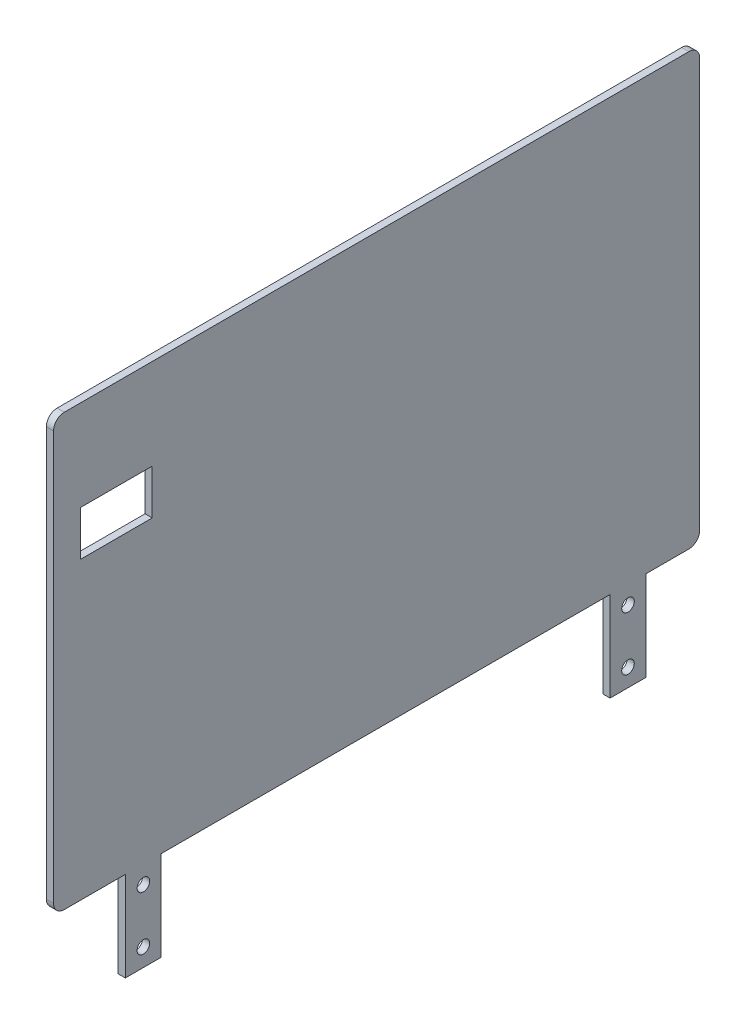
ISO-10303-21;
HEADER;
FILE_DESCRIPTION(('STEP AP214'),'2;1');
FILE_NAME('part.step','',(''),(''),'','','');
FILE_SCHEMA(('AUTOMOTIVE_DESIGN { 1 0 10303 214 1 1 1 1 }'));
ENDSEC;
DATA;
#1=APPLICATION_CONTEXT('core data for automotive mechanical design processes');
#2=APPLICATION_PROTOCOL_DEFINITION('international standard','automotive_design',2000,#1);
#3=PRODUCT_CONTEXT('',#1,'mechanical');
#4=PRODUCT('Part','Part','',(#3));
#5=PRODUCT_RELATED_PRODUCT_CATEGORY('part','',(#4));
#6=PRODUCT_DEFINITION_FORMATION('','',#4);
#7=PRODUCT_DEFINITION_CONTEXT('part definition',#1,'design');
#8=PRODUCT_DEFINITION('design','',#6,#7);
#9=PRODUCT_DEFINITION_SHAPE('','',#8);
#10=(LENGTH_UNIT() NAMED_UNIT(*) SI_UNIT(.MILLI.,.METRE.));
#11=(NAMED_UNIT(*) PLANE_ANGLE_UNIT() SI_UNIT($,.RADIAN.));
#12=(NAMED_UNIT(*) SI_UNIT($,.STERADIAN.) SOLID_ANGLE_UNIT());
#13=UNCERTAINTY_MEASURE_WITH_UNIT(LENGTH_MEASURE(1.E-05),#10,'distance_accuracy_value','');
#14=(GEOMETRIC_REPRESENTATION_CONTEXT(3) GLOBAL_UNCERTAINTY_ASSIGNED_CONTEXT((#13)) GLOBAL_UNIT_ASSIGNED_CONTEXT((#10,
#11,#12)) REPRESENTATION_CONTEXT('',''));
#15=CARTESIAN_POINT('',(0.,0.,0.));
#16=DIRECTION('',(0.,0.,1.));
#17=DIRECTION('',(1.,0.,0.));
#18=AXIS2_PLACEMENT_3D('',#15,#16,#17);
#19=CARTESIAN_POINT('',(2.,-154.,180.));
#20=DIRECTION('',(0.,1.,0.));
#21=DIRECTION('',(0.,0.,1.));
#22=AXIS2_PLACEMENT_3D('',#19,#20,#21);
#23=PLANE('',#22);
#24=DIRECTION('',(-1.,0.,0.));
#25=VECTOR('',#24,1.);
#26=CARTESIAN_POINT('',(2.,-154.,140.));
#27=LINE('',#26,#25);
#28=CARTESIAN_POINT('',(2.,-154.,140.));
#29=VERTEX_POINT('',#28);
#30=CARTESIAN_POINT('',(-2.,-154.,140.));
#31=VERTEX_POINT('',#30);
#32=EDGE_CURVE('E358',#29,#31,#27,.T.);
#33=ORIENTED_EDGE('',*,*,#32,.F.);
#34=DIRECTION('',(0.,0.,-1.));
#35=VECTOR('',#34,1.);
#36=CARTESIAN_POINT('',(2.,-154.,180.));
#37=LINE('',#36,#35);
#38=CARTESIAN_POINT('',(2.,-154.,174.));
#39=VERTEX_POINT('',#38);
#40=EDGE_CURVE('E197',#39,#29,#37,.T.);
#41=ORIENTED_EDGE('',*,*,#40,.F.);
#42=DIRECTION('',(-1.,0.,0.));
#43=VECTOR('',#42,1.);
#44=CARTESIAN_POINT('',(2.,-154.,174.));
#45=LINE('',#44,#43);
#46=CARTESIAN_POINT('',(-2.,-154.,174.));
#47=VERTEX_POINT('',#46);
#48=EDGE_CURVE('E304',#39,#47,#45,.T.);
#49=ORIENTED_EDGE('',*,*,#48,.T.);
#50=DIRECTION('',(0.,0.,-1.));
#51=VECTOR('',#50,1.);
#52=CARTESIAN_POINT('',(-2.,-154.,180.));
#53=LINE('',#52,#51);
#54=EDGE_CURVE('E270',#47,#31,#53,.T.);
#55=ORIENTED_EDGE('',*,*,#54,.T.);
#56=EDGE_LOOP('',(#33,#41,#49,#55));
#57=FACE_BOUND('',#56,.T.);
#58=ADVANCED_FACE('F44',(#57),#23,.F.);
#59=CARTESIAN_POINT('',(2.,-154.,120.));
#60=VERTEX_POINT('',#59);
#61=CARTESIAN_POINT('',(2.,-154.,-130.074687188502));
#62=VERTEX_POINT('',#61);
#63=EDGE_CURVE('E279',#60,#62,#37,.T.);
#64=ORIENTED_EDGE('',*,*,#63,.F.);
#65=DIRECTION('',(-1.,0.,0.));
#66=VECTOR('',#65,1.);
#67=CARTESIAN_POINT('',(2.,-154.,120.));
#68=LINE('',#67,#66);
#69=CARTESIAN_POINT('',(-2.,-154.,120.));
#70=VERTEX_POINT('',#69);
#71=EDGE_CURVE('E212',#60,#70,#68,.T.);
#72=ORIENTED_EDGE('',*,*,#71,.T.);
#73=CARTESIAN_POINT('',(-2.,-154.,-130.074687188502));
#74=VERTEX_POINT('',#73);
#75=EDGE_CURVE('E293',#70,#74,#53,.T.);
#76=ORIENTED_EDGE('',*,*,#75,.T.);
#77=DIRECTION('',(-1.,0.,0.));
#78=VECTOR('',#77,1.);
#79=CARTESIAN_POINT('',(2.,-154.,-130.074687188502));
#80=LINE('',#79,#78);
#81=EDGE_CURVE('E216',#62,#74,#80,.T.);
#82=ORIENTED_EDGE('',*,*,#81,.F.);
#83=EDGE_LOOP('',(#64,#72,#76,#82));
#84=FACE_BOUND('',#83,.T.);
#85=ADVANCED_FACE('F363',(#84),#23,.F.);
#86=CARTESIAN_POINT('',(2.,-154.,-180.));
#87=DIRECTION('',(0.,0.,1.));
#88=DIRECTION('',(1.,0.,0.));
#89=AXIS2_PLACEMENT_3D('',#86,#87,#88);
#90=PLANE('',#89);
#91=DIRECTION('',(0.,1.,0.));
#92=VECTOR('',#91,1.);
#93=CARTESIAN_POINT('',(2.,-154.,-180.));
#94=LINE('',#93,#92);
#95=CARTESIAN_POINT('',(2.,-148.,-180.));
#96=VERTEX_POINT('',#95);
#97=CARTESIAN_POINT('',(2.,80.,-180.));
#98=VERTEX_POINT('',#97);
#99=EDGE_CURVE('E266',#96,#98,#94,.T.);
#100=ORIENTED_EDGE('',*,*,#99,.F.);
#101=DIRECTION('',(-1.,0.,0.));
#102=VECTOR('',#101,1.);
#103=CARTESIAN_POINT('',(2.,-148.,-180.));
#104=LINE('',#103,#102);
#105=CARTESIAN_POINT('',(-2.,-148.,-180.));
#106=VERTEX_POINT('',#105);
#107=EDGE_CURVE('E291',#96,#106,#104,.T.);
#108=ORIENTED_EDGE('',*,*,#107,.T.);
#109=DIRECTION('',(0.,1.,0.));
#110=VECTOR('',#109,1.);
#111=CARTESIAN_POINT('',(-2.,-154.,-180.));
#112=LINE('',#111,#110);
#113=CARTESIAN_POINT('',(-2.,80.,-180.));
#114=VERTEX_POINT('',#113);
#115=EDGE_CURVE('E259',#106,#114,#112,.T.);
#116=ORIENTED_EDGE('',*,*,#115,.T.);
#117=DIRECTION('',(-1.,0.,0.));
#118=VECTOR('',#117,1.);
#119=CARTESIAN_POINT('',(2.,80.,-180.));
#120=LINE('',#119,#118);
#121=EDGE_CURVE('E278',#114,#98,#120,.F.);
#122=ORIENTED_EDGE('',*,*,#121,.T.);
#123=EDGE_LOOP('',(#100,#108,#116,#122));
#124=FACE_BOUND('',#123,.T.);
#125=ADVANCED_FACE('F380',(#124),#90,.F.);
#126=CARTESIAN_POINT('',(2.,86.,180.));
#127=DIRECTION('',(0.,-1.,0.));
#128=DIRECTION('',(0.,0.,-1.));
#129=AXIS2_PLACEMENT_3D('',#126,#127,#128);
#130=PLANE('',#129);
#131=DIRECTION('',(0.,0.,1.));
#132=VECTOR('',#131,1.);
#133=CARTESIAN_POINT('',(-2.,86.,180.));
#134=LINE('',#133,#132);
#135=CARTESIAN_POINT('',(-2.,86.,-174.));
#136=VERTEX_POINT('',#135);
#137=CARTESIAN_POINT('',(-2.,86.,174.));
#138=VERTEX_POINT('',#137);
#139=EDGE_CURVE('E281',#136,#138,#134,.T.);
#140=ORIENTED_EDGE('',*,*,#139,.T.);
#141=DIRECTION('',(-1.,0.,0.));
#142=VECTOR('',#141,1.);
#143=CARTESIAN_POINT('',(2.,86.,174.));
#144=LINE('',#143,#142);
#145=CARTESIAN_POINT('',(2.,86.,174.));
#146=VERTEX_POINT('',#145);
#147=EDGE_CURVE('E11',#138,#146,#144,.F.);
#148=ORIENTED_EDGE('',*,*,#147,.T.);
#149=DIRECTION('',(0.,0.,1.));
#150=VECTOR('',#149,1.);
#151=CARTESIAN_POINT('',(2.,86.,180.));
#152=LINE('',#151,#150);
#153=CARTESIAN_POINT('',(2.,86.,-174.));
#154=VERTEX_POINT('',#153);
#155=EDGE_CURVE('E268',#154,#146,#152,.T.);
#156=ORIENTED_EDGE('',*,*,#155,.F.);
#157=DIRECTION('',(-1.,0.,0.));
#158=VECTOR('',#157,1.);
#159=CARTESIAN_POINT('',(2.,86.,-174.));
#160=LINE('',#159,#158);
#161=EDGE_CURVE('E52',#154,#136,#160,.T.);
#162=ORIENTED_EDGE('',*,*,#161,.T.);
#163=EDGE_LOOP('',(#140,#148,#156,#162));
#164=FACE_BOUND('',#163,.T.);
#165=ADVANCED_FACE('F330',(#164),#130,.F.);
#166=CARTESIAN_POINT('',(2.,-154.,180.));
#167=DIRECTION('',(0.,0.,-1.));
#168=DIRECTION('',(-1.,0.,0.));
#169=AXIS2_PLACEMENT_3D('',#166,#167,#168);
#170=PLANE('',#169);
#171=DIRECTION('',(0.,-1.,0.));
#172=VECTOR('',#171,1.);
#173=CARTESIAN_POINT('',(-2.,-154.,180.));
#174=LINE('',#173,#172);
#175=CARTESIAN_POINT('',(-2.,80.,180.));
#176=VERTEX_POINT('',#175);
#177=CARTESIAN_POINT('',(-2.,-148.,180.));
#178=VERTEX_POINT('',#177);
#179=EDGE_CURVE('E282',#176,#178,#174,.T.);
#180=ORIENTED_EDGE('',*,*,#179,.T.);
#181=DIRECTION('',(-1.,0.,0.));
#182=VECTOR('',#181,1.);
#183=CARTESIAN_POINT('',(2.,-148.,180.));
#184=LINE('',#183,#182);
#185=CARTESIAN_POINT('',(2.,-148.,180.));
#186=VERTEX_POINT('',#185);
#187=EDGE_CURVE('E325',#178,#186,#184,.F.);
#188=ORIENTED_EDGE('',*,*,#187,.T.);
#189=DIRECTION('',(0.,-1.,0.));
#190=VECTOR('',#189,1.);
#191=CARTESIAN_POINT('',(2.,-154.,180.));
#192=LINE('',#191,#190);
#193=CARTESIAN_POINT('',(2.,80.,180.));
#194=VERTEX_POINT('',#193);
#195=EDGE_CURVE('E271',#194,#186,#192,.T.);
#196=ORIENTED_EDGE('',*,*,#195,.F.);
#197=DIRECTION('',(-1.,0.,0.));
#198=VECTOR('',#197,1.);
#199=CARTESIAN_POINT('',(2.,80.,180.));
#200=LINE('',#199,#198);
#201=EDGE_CURVE('E316',#194,#176,#200,.T.);
#202=ORIENTED_EDGE('',*,*,#201,.T.);
#203=EDGE_LOOP('',(#180,#188,#196,#202));
#204=FACE_BOUND('',#203,.T.);
#205=ADVANCED_FACE('F345',(#204),#170,.F.);
#206=CARTESIAN_POINT('',(2.,-154.,-150.074687188502));
#207=VERTEX_POINT('',#206);
#208=CARTESIAN_POINT('',(2.,-154.,-174.));
#209=VERTEX_POINT('',#208);
#210=EDGE_CURVE('E277',#207,#209,#37,.T.);
#211=ORIENTED_EDGE('',*,*,#210,.F.);
#212=DIRECTION('',(-1.,0.,0.));
#213=VECTOR('',#212,1.);
#214=CARTESIAN_POINT('',(2.,-154.,-150.074687188502));
#215=LINE('',#214,#213);
#216=CARTESIAN_POINT('',(-2.,-154.,-150.074687188502));
#217=VERTEX_POINT('',#216);
#218=EDGE_CURVE('E211',#207,#217,#215,.T.);
#219=ORIENTED_EDGE('',*,*,#218,.T.);
#220=CARTESIAN_POINT('',(-2.,-154.,-174.));
#221=VERTEX_POINT('',#220);
#222=EDGE_CURVE('E289',#217,#221,#53,.T.);
#223=ORIENTED_EDGE('',*,*,#222,.T.);
#224=DIRECTION('',(-1.,0.,0.));
#225=VECTOR('',#224,1.);
#226=CARTESIAN_POINT('',(2.,-154.,-174.));
#227=LINE('',#226,#225);
#228=EDGE_CURVE('E308',#221,#209,#227,.F.);
#229=ORIENTED_EDGE('',*,*,#228,.T.);
#230=EDGE_LOOP('',(#211,#219,#223,#229));
#231=FACE_BOUND('',#230,.T.);
#232=ADVANCED_FACE('F367',(#231),#23,.F.);
#233=CARTESIAN_POINT('',(2.,0.,0.));
#234=DIRECTION('',(-1.,0.,0.));
#235=DIRECTION('',(0.,0.,1.));
#236=AXIS2_PLACEMENT_3D('',#233,#234,#235);
#237=PLANE('',#236);
#238=CARTESIAN_POINT('',(2.,-194.,129.925312811498));
#239=DIRECTION('',(1.,0.,0.));
#240=DIRECTION('',(0.,0.,-1.));
#241=AXIS2_PLACEMENT_3D('',#238,#239,#240);
#242=CIRCLE('',#241,3.49999999999998);
#243=CARTESIAN_POINT('',(2.,-194.,126.425312811498));
#244=VERTEX_POINT('',#243);
#245=EDGE_CURVE('E625',#244,#244,#242,.T.);
#246=ORIENTED_EDGE('',*,*,#245,.F.);
#247=EDGE_LOOP('',(#246));
#248=FACE_BOUND('',#247,.T.);
#249=CARTESIAN_POINT('',(2.,-164.,129.925312811498));
#250=DIRECTION('',(1.,0.,0.));
#251=DIRECTION('',(0.,0.,-1.));
#252=AXIS2_PLACEMENT_3D('',#249,#250,#251);
#253=CIRCLE('',#252,3.49999999999998);
#254=CARTESIAN_POINT('',(2.,-164.,126.425312811498));
#255=VERTEX_POINT('',#254);
#256=EDGE_CURVE('E624',#255,#255,#253,.T.);
#257=ORIENTED_EDGE('',*,*,#256,.F.);
#258=EDGE_LOOP('',(#257));
#259=FACE_BOUND('',#258,.T.);
#260=CARTESIAN_POINT('',(2.,-194.,-140.074687188502));
#261=DIRECTION('',(1.,0.,0.));
#262=DIRECTION('',(0.,0.,-1.));
#263=AXIS2_PLACEMENT_3D('',#260,#261,#262);
#264=CIRCLE('',#263,3.49999999999998);
#265=CARTESIAN_POINT('',(2.,-194.,-143.574687188502));
#266=VERTEX_POINT('',#265);
#267=EDGE_CURVE('E635',#266,#266,#264,.T.);
#268=ORIENTED_EDGE('',*,*,#267,.F.);
#269=EDGE_LOOP('',(#268));
#270=FACE_BOUND('',#269,.T.);
#271=CARTESIAN_POINT('',(2.,-164.,-140.074687188502));
#272=DIRECTION('',(1.,0.,0.));
#273=DIRECTION('',(0.,0.,-1.));
#274=AXIS2_PLACEMENT_3D('',#271,#272,#273);
#275=CIRCLE('',#274,3.49999999999998);
#276=CARTESIAN_POINT('',(2.,-164.,-143.574687188502));
#277=VERTEX_POINT('',#276);
#278=EDGE_CURVE('E637',#277,#277,#275,.T.);
#279=ORIENTED_EDGE('',*,*,#278,.F.);
#280=EDGE_LOOP('',(#279));
#281=FACE_BOUND('',#280,.T.);
#282=DIRECTION('',(0.,0.,1.));
#283=VECTOR('',#282,1.);
#284=CARTESIAN_POINT('',(2.,35.5,165.));
#285=LINE('',#284,#283);
#286=CARTESIAN_POINT('',(2.,35.5,125.));
#287=VERTEX_POINT('',#286);
#288=CARTESIAN_POINT('',(2.,35.5,165.));
#289=VERTEX_POINT('',#288);
#290=EDGE_CURVE('E209',#287,#289,#285,.T.);
#291=ORIENTED_EDGE('',*,*,#290,.F.);
#292=DIRECTION('',(0.,1.,0.));
#293=VECTOR('',#292,1.);
#294=CARTESIAN_POINT('',(2.,10.5,125.));
#295=LINE('',#294,#293);
#296=CARTESIAN_POINT('',(2.,10.5,125.));
#297=VERTEX_POINT('',#296);
#298=EDGE_CURVE('E210',#297,#287,#295,.T.);
#299=ORIENTED_EDGE('',*,*,#298,.F.);
#300=DIRECTION('',(0.,0.,-1.));
#301=VECTOR('',#300,1.);
#302=CARTESIAN_POINT('',(2.,10.5,165.));
#303=LINE('',#302,#301);
#304=CARTESIAN_POINT('',(2.,10.5,165.));
#305=VERTEX_POINT('',#304);
#306=EDGE_CURVE('E239',#305,#297,#303,.T.);
#307=ORIENTED_EDGE('',*,*,#306,.F.);
#308=DIRECTION('',(0.,-1.,0.));
#309=VECTOR('',#308,1.);
#310=CARTESIAN_POINT('',(2.,10.5,165.));
#311=LINE('',#310,#309);
#312=EDGE_CURVE('E255',#289,#305,#311,.T.);
#313=ORIENTED_EDGE('',*,*,#312,.F.);
#314=EDGE_LOOP('',(#291,#299,#307,#313));
#315=FACE_BOUND('',#314,.T.);
#316=ORIENTED_EDGE('',*,*,#40,.T.);
#317=DIRECTION('',(0.,-1.,0.));
#318=VECTOR('',#317,1.);
#319=CARTESIAN_POINT('',(2.,-154.,140.));
#320=LINE('',#319,#318);
#321=CARTESIAN_POINT('',(2.,-204.,140.));
#322=VERTEX_POINT('',#321);
#323=EDGE_CURVE('E191',#29,#322,#320,.T.);
#324=ORIENTED_EDGE('',*,*,#323,.T.);
#325=DIRECTION('',(0.,0.,-1.));
#326=VECTOR('',#325,1.);
#327=CARTESIAN_POINT('',(2.,-204.,140.));
#328=LINE('',#327,#326);
#329=CARTESIAN_POINT('',(2.,-204.,120.));
#330=VERTEX_POINT('',#329);
#331=EDGE_CURVE('E184',#322,#330,#328,.T.);
#332=ORIENTED_EDGE('',*,*,#331,.T.);
#333=DIRECTION('',(0.,1.,0.));
#334=VECTOR('',#333,1.);
#335=CARTESIAN_POINT('',(2.,-154.,120.));
#336=LINE('',#335,#334);
#337=EDGE_CURVE('E194',#330,#60,#336,.T.);
#338=ORIENTED_EDGE('',*,*,#337,.T.);
#339=ORIENTED_EDGE('',*,*,#63,.T.);
#340=DIRECTION('',(0.,-1.,0.));
#341=VECTOR('',#340,1.);
#342=CARTESIAN_POINT('',(2.,-154.,-130.074687188502));
#343=LINE('',#342,#341);
#344=CARTESIAN_POINT('',(2.,-204.,-130.074687188502));
#345=VERTEX_POINT('',#344);
#346=EDGE_CURVE('E231',#62,#345,#343,.T.);
#347=ORIENTED_EDGE('',*,*,#346,.T.);
#348=DIRECTION('',(0.,0.,-1.));
#349=VECTOR('',#348,1.);
#350=CARTESIAN_POINT('',(2.,-204.,-150.074687188502));
#351=LINE('',#350,#349);
#352=CARTESIAN_POINT('',(2.,-204.,-150.074687188502));
#353=VERTEX_POINT('',#352);
#354=EDGE_CURVE('E225',#345,#353,#351,.T.);
#355=ORIENTED_EDGE('',*,*,#354,.T.);
#356=DIRECTION('',(0.,1.,0.));
#357=VECTOR('',#356,1.);
#358=CARTESIAN_POINT('',(2.,-154.,-150.074687188502));
#359=LINE('',#358,#357);
#360=EDGE_CURVE('E230',#353,#207,#359,.T.);
#361=ORIENTED_EDGE('',*,*,#360,.T.);
#362=ORIENTED_EDGE('',*,*,#210,.T.);
#363=CARTESIAN_POINT('',(2.,-148.,-174.));
#364=DIRECTION('',(-1.,0.,0.));
#365=DIRECTION('',(0.,0.,1.));
#366=AXIS2_PLACEMENT_3D('',#363,#364,#365);
#367=CIRCLE('',#366,6.);
#368=EDGE_CURVE('E320',#209,#96,#367,.F.);
#369=ORIENTED_EDGE('',*,*,#368,.T.);
#370=ORIENTED_EDGE('',*,*,#99,.T.);
#371=CARTESIAN_POINT('',(2.,80.,-174.));
#372=DIRECTION('',(-1.,0.,0.));
#373=DIRECTION('',(0.,0.,1.));
#374=AXIS2_PLACEMENT_3D('',#371,#372,#373);
#375=CIRCLE('',#374,6.);
#376=EDGE_CURVE('E311',#98,#154,#375,.F.);
#377=ORIENTED_EDGE('',*,*,#376,.T.);
#378=ORIENTED_EDGE('',*,*,#155,.T.);
#379=CARTESIAN_POINT('',(2.,80.,174.));
#380=DIRECTION('',(-1.,0.,0.));
#381=DIRECTION('',(0.,0.,1.));
#382=AXIS2_PLACEMENT_3D('',#379,#380,#381);
#383=CIRCLE('',#382,6.);
#384=EDGE_CURVE('E312',#146,#194,#383,.F.);
#385=ORIENTED_EDGE('',*,*,#384,.T.);
#386=ORIENTED_EDGE('',*,*,#195,.T.);
#387=CARTESIAN_POINT('',(2.,-148.,174.));
#388=DIRECTION('',(-1.,0.,0.));
#389=DIRECTION('',(0.,0.,1.));
#390=AXIS2_PLACEMENT_3D('',#387,#388,#389);
#391=CIRCLE('',#390,6.);
#392=EDGE_CURVE('E314',#186,#39,#391,.F.);
#393=ORIENTED_EDGE('',*,*,#392,.T.);
#394=EDGE_LOOP('',(#316,#324,#332,#338,#339,#347,#355,#361,#362,#369,#370,#377,#378,#385,#386,#393));
#395=FACE_BOUND('',#394,.T.);
#396=ADVANCED_FACE('F200',(#248,#259,#270,#281,#315,#395),#237,.F.);
#397=CARTESIAN_POINT('',(-2.,0.,0.));
#398=DIRECTION('',(-1.,0.,0.));
#399=DIRECTION('',(0.,0.,1.));
#400=AXIS2_PLACEMENT_3D('',#397,#398,#399);
#401=PLANE('',#400);
#402=CARTESIAN_POINT('',(-2.,-194.,129.925312811498));
#403=DIRECTION('',(1.,0.,0.));
#404=DIRECTION('',(0.,0.,-1.));
#405=AXIS2_PLACEMENT_3D('',#402,#403,#404);
#406=CIRCLE('',#405,3.5);
#407=CARTESIAN_POINT('',(-2.,-194.,126.425312811498));
#408=VERTEX_POINT('',#407);
#409=EDGE_CURVE('E620',#408,#408,#406,.T.);
#410=ORIENTED_EDGE('',*,*,#409,.T.);
#411=EDGE_LOOP('',(#410));
#412=FACE_BOUND('',#411,.T.);
#413=CARTESIAN_POINT('',(-2.,-164.,129.925312811498));
#414=DIRECTION('',(1.,0.,0.));
#415=DIRECTION('',(0.,0.,-1.));
#416=AXIS2_PLACEMENT_3D('',#413,#414,#415);
#417=CIRCLE('',#416,3.5);
#418=CARTESIAN_POINT('',(-2.,-164.,126.425312811498));
#419=VERTEX_POINT('',#418);
#420=EDGE_CURVE('E627',#419,#419,#417,.T.);
#421=ORIENTED_EDGE('',*,*,#420,.T.);
#422=EDGE_LOOP('',(#421));
#423=FACE_BOUND('',#422,.T.);
#424=CARTESIAN_POINT('',(-2.,-194.,-140.074687188502));
#425=DIRECTION('',(1.,0.,0.));
#426=DIRECTION('',(0.,0.,-1.));
#427=AXIS2_PLACEMENT_3D('',#424,#425,#426);
#428=CIRCLE('',#427,3.5);
#429=CARTESIAN_POINT('',(-2.,-194.,-143.574687188502));
#430=VERTEX_POINT('',#429);
#431=EDGE_CURVE('E634',#430,#430,#428,.T.);
#432=ORIENTED_EDGE('',*,*,#431,.T.);
#433=EDGE_LOOP('',(#432));
#434=FACE_BOUND('',#433,.T.);
#435=CARTESIAN_POINT('',(-2.,-164.,-140.074687188502));
#436=DIRECTION('',(1.,0.,0.));
#437=DIRECTION('',(0.,0.,-1.));
#438=AXIS2_PLACEMENT_3D('',#435,#436,#437);
#439=CIRCLE('',#438,3.5);
#440=CARTESIAN_POINT('',(-2.,-164.,-143.574687188502));
#441=VERTEX_POINT('',#440);
#442=EDGE_CURVE('E220',#441,#441,#439,.T.);
#443=ORIENTED_EDGE('',*,*,#442,.T.);
#444=EDGE_LOOP('',(#443));
#445=FACE_BOUND('',#444,.T.);
#446=DIRECTION('',(0.,1.,0.));
#447=VECTOR('',#446,1.);
#448=CARTESIAN_POINT('',(-2.,10.5,125.));
#449=LINE('',#448,#447);
#450=CARTESIAN_POINT('',(-2.,10.5,125.));
#451=VERTEX_POINT('',#450);
#452=CARTESIAN_POINT('',(-2.,35.5,125.));
#453=VERTEX_POINT('',#452);
#454=EDGE_CURVE('E236',#451,#453,#449,.T.);
#455=ORIENTED_EDGE('',*,*,#454,.T.);
#456=DIRECTION('',(0.,0.,1.));
#457=VECTOR('',#456,1.);
#458=CARTESIAN_POINT('',(-2.,35.5,165.));
#459=LINE('',#458,#457);
#460=CARTESIAN_POINT('',(-2.,35.5,165.));
#461=VERTEX_POINT('',#460);
#462=EDGE_CURVE('E237',#453,#461,#459,.T.);
#463=ORIENTED_EDGE('',*,*,#462,.T.);
#464=DIRECTION('',(0.,-1.,0.));
#465=VECTOR('',#464,1.);
#466=CARTESIAN_POINT('',(-2.,10.5,165.));
#467=LINE('',#466,#465);
#468=CARTESIAN_POINT('',(-2.,10.5,165.));
#469=VERTEX_POINT('',#468);
#470=EDGE_CURVE('E243',#461,#469,#467,.T.);
#471=ORIENTED_EDGE('',*,*,#470,.T.);
#472=DIRECTION('',(0.,0.,-1.));
#473=VECTOR('',#472,1.);
#474=CARTESIAN_POINT('',(-2.,10.5,165.));
#475=LINE('',#474,#473);
#476=EDGE_CURVE('E246',#469,#451,#475,.T.);
#477=ORIENTED_EDGE('',*,*,#476,.T.);
#478=EDGE_LOOP('',(#455,#463,#471,#477));
#479=FACE_BOUND('',#478,.T.);
#480=ORIENTED_EDGE('',*,*,#115,.F.);
#481=CARTESIAN_POINT('',(-2.,-148.,-174.));
#482=DIRECTION('',(-1.,0.,0.));
#483=DIRECTION('',(0.,0.,1.));
#484=AXIS2_PLACEMENT_3D('',#481,#482,#483);
#485=CIRCLE('',#484,6.);
#486=EDGE_CURVE('E305',#106,#221,#485,.T.);
#487=ORIENTED_EDGE('',*,*,#486,.T.);
#488=ORIENTED_EDGE('',*,*,#222,.F.);
#489=DIRECTION('',(0.,1.,0.));
#490=VECTOR('',#489,1.);
#491=CARTESIAN_POINT('',(-2.,-154.,-150.074687188502));
#492=LINE('',#491,#490);
#493=CARTESIAN_POINT('',(-2.,-204.,-150.074687188502));
#494=VERTEX_POINT('',#493);
#495=EDGE_CURVE('E58',#494,#217,#492,.T.);
#496=ORIENTED_EDGE('',*,*,#495,.F.);
#497=DIRECTION('',(0.,0.,-1.));
#498=VECTOR('',#497,1.);
#499=CARTESIAN_POINT('',(-2.,-204.,-150.074687188502));
#500=LINE('',#499,#498);
#501=CARTESIAN_POINT('',(-2.,-204.,-130.074687188502));
#502=VERTEX_POINT('',#501);
#503=EDGE_CURVE('E228',#502,#494,#500,.T.);
#504=ORIENTED_EDGE('',*,*,#503,.F.);
#505=DIRECTION('',(0.,-1.,0.));
#506=VECTOR('',#505,1.);
#507=CARTESIAN_POINT('',(-2.,-154.,-130.074687188502));
#508=LINE('',#507,#506);
#509=EDGE_CURVE('E226',#74,#502,#508,.T.);
#510=ORIENTED_EDGE('',*,*,#509,.F.);
#511=ORIENTED_EDGE('',*,*,#75,.F.);
#512=DIRECTION('',(0.,1.,0.));
#513=VECTOR('',#512,1.);
#514=CARTESIAN_POINT('',(-2.,-154.,120.));
#515=LINE('',#514,#513);
#516=CARTESIAN_POINT('',(-2.,-204.,120.));
#517=VERTEX_POINT('',#516);
#518=EDGE_CURVE('E70',#517,#70,#515,.T.);
#519=ORIENTED_EDGE('',*,*,#518,.F.);
#520=DIRECTION('',(0.,0.,-1.));
#521=VECTOR('',#520,1.);
#522=CARTESIAN_POINT('',(-2.,-204.,140.));
#523=LINE('',#522,#521);
#524=CARTESIAN_POINT('',(-2.,-204.,140.));
#525=VERTEX_POINT('',#524);
#526=EDGE_CURVE('E347',#525,#517,#523,.T.);
#527=ORIENTED_EDGE('',*,*,#526,.F.);
#528=DIRECTION('',(0.,-1.,0.));
#529=VECTOR('',#528,1.);
#530=CARTESIAN_POINT('',(-2.,-154.,140.));
#531=LINE('',#530,#529);
#532=EDGE_CURVE('E207',#31,#525,#531,.T.);
#533=ORIENTED_EDGE('',*,*,#532,.F.);
#534=ORIENTED_EDGE('',*,*,#54,.F.);
#535=CARTESIAN_POINT('',(-2.,-148.,174.));
#536=DIRECTION('',(-1.,0.,0.));
#537=DIRECTION('',(0.,0.,1.));
#538=AXIS2_PLACEMENT_3D('',#535,#536,#537);
#539=CIRCLE('',#538,6.);
#540=EDGE_CURVE('E297',#47,#178,#539,.T.);
#541=ORIENTED_EDGE('',*,*,#540,.T.);
#542=ORIENTED_EDGE('',*,*,#179,.F.);
#543=CARTESIAN_POINT('',(-2.,80.,174.));
#544=DIRECTION('',(-1.,0.,0.));
#545=DIRECTION('',(0.,0.,1.));
#546=AXIS2_PLACEMENT_3D('',#543,#544,#545);
#547=CIRCLE('',#546,6.);
#548=EDGE_CURVE('E296',#176,#138,#547,.T.);
#549=ORIENTED_EDGE('',*,*,#548,.T.);
#550=ORIENTED_EDGE('',*,*,#139,.F.);
#551=CARTESIAN_POINT('',(-2.,80.,-174.));
#552=DIRECTION('',(-1.,0.,0.));
#553=DIRECTION('',(0.,0.,1.));
#554=AXIS2_PLACEMENT_3D('',#551,#552,#553);
#555=CIRCLE('',#554,6.);
#556=EDGE_CURVE('E298',#136,#114,#555,.T.);
#557=ORIENTED_EDGE('',*,*,#556,.T.);
#558=EDGE_LOOP('',(#480,#487,#488,#496,#504,#510,#511,#519,#527,#533,#534,#541,#542,#549,#550,#557));
#559=FACE_BOUND('',#558,.T.);
#560=ADVANCED_FACE('F333',(#412,#423,#434,#445,#479,#559),#401,.T.);
#561=CARTESIAN_POINT('',(2.,-148.,-174.));
#562=DIRECTION('',(-1.,0.,0.));
#563=DIRECTION('',(0.,0.,1.));
#564=AXIS2_PLACEMENT_3D('',#561,#562,#563);
#565=CYLINDRICAL_SURFACE('',#564,6.);
#566=ORIENTED_EDGE('',*,*,#368,.F.);
#567=ORIENTED_EDGE('',*,*,#228,.F.);
#568=ORIENTED_EDGE('',*,*,#486,.F.);
#569=ORIENTED_EDGE('',*,*,#107,.F.);
#570=EDGE_LOOP('',(#566,#567,#568,#569));
#571=FACE_BOUND('',#570,.T.);
#572=ADVANCED_FACE('F372',(#571),#565,.T.);
#573=CARTESIAN_POINT('',(2.,-148.,174.));
#574=DIRECTION('',(-1.,0.,0.));
#575=DIRECTION('',(0.,0.,1.));
#576=AXIS2_PLACEMENT_3D('',#573,#574,#575);
#577=CYLINDRICAL_SURFACE('',#576,6.);
#578=ORIENTED_EDGE('',*,*,#392,.F.);
#579=ORIENTED_EDGE('',*,*,#187,.F.);
#580=ORIENTED_EDGE('',*,*,#540,.F.);
#581=ORIENTED_EDGE('',*,*,#48,.F.);
#582=EDGE_LOOP('',(#578,#579,#580,#581));
#583=FACE_BOUND('',#582,.T.);
#584=ADVANCED_FACE('F346',(#583),#577,.T.);
#585=CARTESIAN_POINT('',(2.,80.,174.));
#586=DIRECTION('',(-1.,0.,0.));
#587=DIRECTION('',(0.,0.,1.));
#588=AXIS2_PLACEMENT_3D('',#585,#586,#587);
#589=CYLINDRICAL_SURFACE('',#588,6.);
#590=ORIENTED_EDGE('',*,*,#384,.F.);
#591=ORIENTED_EDGE('',*,*,#147,.F.);
#592=ORIENTED_EDGE('',*,*,#548,.F.);
#593=ORIENTED_EDGE('',*,*,#201,.F.);
#594=EDGE_LOOP('',(#590,#591,#592,#593));
#595=FACE_BOUND('',#594,.T.);
#596=ADVANCED_FACE('F339',(#595),#589,.T.);
#597=CARTESIAN_POINT('',(2.,80.,-174.));
#598=DIRECTION('',(-1.,0.,0.));
#599=DIRECTION('',(0.,0.,1.));
#600=AXIS2_PLACEMENT_3D('',#597,#598,#599);
#601=CYLINDRICAL_SURFACE('',#600,6.);
#602=ORIENTED_EDGE('',*,*,#376,.F.);
#603=ORIENTED_EDGE('',*,*,#121,.F.);
#604=ORIENTED_EDGE('',*,*,#556,.F.);
#605=ORIENTED_EDGE('',*,*,#161,.F.);
#606=EDGE_LOOP('',(#602,#603,#604,#605));
#607=FACE_BOUND('',#606,.T.);
#608=ADVANCED_FACE('F50',(#607),#601,.T.);
#609=CARTESIAN_POINT('',(-2.,10.5,125.));
#610=DIRECTION('',(0.,0.,-1.));
#611=DIRECTION('',(-1.,0.,0.));
#612=AXIS2_PLACEMENT_3D('',#609,#610,#611);
#613=PLANE('',#612);
#614=ORIENTED_EDGE('',*,*,#298,.T.);
#615=DIRECTION('',(1.,0.,0.));
#616=VECTOR('',#615,1.);
#617=CARTESIAN_POINT('',(-2.,35.5,125.));
#618=LINE('',#617,#616);
#619=EDGE_CURVE('E247',#453,#287,#618,.T.);
#620=ORIENTED_EDGE('',*,*,#619,.F.);
#621=ORIENTED_EDGE('',*,*,#454,.F.);
#622=DIRECTION('',(1.,0.,0.));
#623=VECTOR('',#622,1.);
#624=CARTESIAN_POINT('',(-2.,10.5,125.));
#625=LINE('',#624,#623);
#626=EDGE_CURVE('E260',#451,#297,#625,.T.);
#627=ORIENTED_EDGE('',*,*,#626,.T.);
#628=EDGE_LOOP('',(#614,#620,#621,#627));
#629=FACE_BOUND('',#628,.T.);
#630=ADVANCED_FACE('F379',(#629),#613,.F.);
#631=CARTESIAN_POINT('',(-2.,10.5,165.));
#632=DIRECTION('',(0.,-1.,0.));
#633=DIRECTION('',(0.,0.,-1.));
#634=AXIS2_PLACEMENT_3D('',#631,#632,#633);
#635=PLANE('',#634);
#636=ORIENTED_EDGE('',*,*,#306,.T.);
#637=ORIENTED_EDGE('',*,*,#626,.F.);
#638=ORIENTED_EDGE('',*,*,#476,.F.);
#639=DIRECTION('',(1.,0.,0.));
#640=VECTOR('',#639,1.);
#641=CARTESIAN_POINT('',(-2.,10.5,165.));
#642=LINE('',#641,#640);
#643=EDGE_CURVE('E256',#469,#305,#642,.T.);
#644=ORIENTED_EDGE('',*,*,#643,.T.);
#645=EDGE_LOOP('',(#636,#637,#638,#644));
#646=FACE_BOUND('',#645,.T.);
#647=ADVANCED_FACE('F383',(#646),#635,.F.);
#648=CARTESIAN_POINT('',(-2.,10.5,165.));
#649=DIRECTION('',(0.,0.,1.));
#650=DIRECTION('',(1.,0.,0.));
#651=AXIS2_PLACEMENT_3D('',#648,#649,#650);
#652=PLANE('',#651);
#653=ORIENTED_EDGE('',*,*,#312,.T.);
#654=ORIENTED_EDGE('',*,*,#643,.F.);
#655=ORIENTED_EDGE('',*,*,#470,.F.);
#656=DIRECTION('',(1.,0.,0.));
#657=VECTOR('',#656,1.);
#658=CARTESIAN_POINT('',(-2.,35.5,165.));
#659=LINE('',#658,#657);
#660=EDGE_CURVE('E261',#461,#289,#659,.T.);
#661=ORIENTED_EDGE('',*,*,#660,.T.);
#662=EDGE_LOOP('',(#653,#654,#655,#661));
#663=FACE_BOUND('',#662,.T.);
#664=ADVANCED_FACE('F442',(#663),#652,.F.);
#665=CARTESIAN_POINT('',(-2.,35.5,165.));
#666=DIRECTION('',(0.,1.,0.));
#667=DIRECTION('',(0.,0.,1.));
#668=AXIS2_PLACEMENT_3D('',#665,#666,#667);
#669=PLANE('',#668);
#670=ORIENTED_EDGE('',*,*,#290,.T.);
#671=ORIENTED_EDGE('',*,*,#660,.F.);
#672=ORIENTED_EDGE('',*,*,#462,.F.);
#673=ORIENTED_EDGE('',*,*,#619,.T.);
#674=EDGE_LOOP('',(#670,#671,#672,#673));
#675=FACE_BOUND('',#674,.T.);
#676=ADVANCED_FACE('F453',(#675),#669,.F.);
#677=CARTESIAN_POINT('',(2.,-154.,-150.074687188502));
#678=DIRECTION('',(0.,0.,1.));
#679=DIRECTION('',(0.,-1.,0.));
#680=AXIS2_PLACEMENT_3D('',#677,#678,#679);
#681=PLANE('',#680);
#682=ORIENTED_EDGE('',*,*,#495,.T.);
#683=ORIENTED_EDGE('',*,*,#218,.F.);
#684=ORIENTED_EDGE('',*,*,#360,.F.);
#685=DIRECTION('',(-1.,0.,0.));
#686=VECTOR('',#685,1.);
#687=CARTESIAN_POINT('',(2.,-204.,-150.074687188502));
#688=LINE('',#687,#686);
#689=EDGE_CURVE('E224',#353,#494,#688,.T.);
#690=ORIENTED_EDGE('',*,*,#689,.T.);
#691=EDGE_LOOP('',(#682,#683,#684,#690));
#692=FACE_BOUND('',#691,.T.);
#693=ADVANCED_FACE('F462',(#692),#681,.F.);
#694=CARTESIAN_POINT('',(2.,-154.,-130.074687188502));
#695=DIRECTION('',(0.,0.,-1.));
#696=DIRECTION('',(-1.,0.,0.));
#697=AXIS2_PLACEMENT_3D('',#694,#695,#696);
#698=PLANE('',#697);
#699=ORIENTED_EDGE('',*,*,#509,.T.);
#700=DIRECTION('',(-1.,0.,0.));
#701=VECTOR('',#700,1.);
#702=CARTESIAN_POINT('',(2.,-204.,-130.074687188502));
#703=LINE('',#702,#701);
#704=EDGE_CURVE('E217',#345,#502,#703,.T.);
#705=ORIENTED_EDGE('',*,*,#704,.F.);
#706=ORIENTED_EDGE('',*,*,#346,.F.);
#707=ORIENTED_EDGE('',*,*,#81,.T.);
#708=EDGE_LOOP('',(#699,#705,#706,#707));
#709=FACE_BOUND('',#708,.T.);
#710=ADVANCED_FACE('F508',(#709),#698,.F.);
#711=CARTESIAN_POINT('',(2.,-204.,-150.074687188502));
#712=DIRECTION('',(0.,1.,0.));
#713=DIRECTION('',(0.,0.,1.));
#714=AXIS2_PLACEMENT_3D('',#711,#712,#713);
#715=PLANE('',#714);
#716=ORIENTED_EDGE('',*,*,#503,.T.);
#717=ORIENTED_EDGE('',*,*,#689,.F.);
#718=ORIENTED_EDGE('',*,*,#354,.F.);
#719=ORIENTED_EDGE('',*,*,#704,.T.);
#720=EDGE_LOOP('',(#716,#717,#718,#719));
#721=FACE_BOUND('',#720,.T.);
#722=ADVANCED_FACE('F518',(#721),#715,.F.);
#723=CARTESIAN_POINT('',(2.,-154.,140.));
#724=DIRECTION('',(0.,0.,-1.));
#725=DIRECTION('',(0.,1.,0.));
#726=AXIS2_PLACEMENT_3D('',#723,#724,#725);
#727=PLANE('',#726);
#728=ORIENTED_EDGE('',*,*,#532,.T.);
#729=DIRECTION('',(-1.,0.,0.));
#730=VECTOR('',#729,1.);
#731=CARTESIAN_POINT('',(2.,-204.,140.));
#732=LINE('',#731,#730);
#733=EDGE_CURVE('E186',#322,#525,#732,.T.);
#734=ORIENTED_EDGE('',*,*,#733,.F.);
#735=ORIENTED_EDGE('',*,*,#323,.F.);
#736=ORIENTED_EDGE('',*,*,#32,.T.);
#737=EDGE_LOOP('',(#728,#734,#735,#736));
#738=FACE_BOUND('',#737,.T.);
#739=ADVANCED_FACE('F203',(#738),#727,.F.);
#740=CARTESIAN_POINT('',(2.,-204.,140.));
#741=DIRECTION('',(0.,1.,0.));
#742=DIRECTION('',(0.,0.,1.));
#743=AXIS2_PLACEMENT_3D('',#740,#741,#742);
#744=PLANE('',#743);
#745=ORIENTED_EDGE('',*,*,#526,.T.);
#746=DIRECTION('',(-1.,0.,0.));
#747=VECTOR('',#746,1.);
#748=CARTESIAN_POINT('',(2.,-204.,120.));
#749=LINE('',#748,#747);
#750=EDGE_CURVE('E192',#330,#517,#749,.T.);
#751=ORIENTED_EDGE('',*,*,#750,.F.);
#752=ORIENTED_EDGE('',*,*,#331,.F.);
#753=ORIENTED_EDGE('',*,*,#733,.T.);
#754=EDGE_LOOP('',(#745,#751,#752,#753));
#755=FACE_BOUND('',#754,.T.);
#756=ADVANCED_FACE('F190',(#755),#744,.F.);
#757=CARTESIAN_POINT('',(2.,-154.,120.));
#758=DIRECTION('',(0.,0.,1.));
#759=DIRECTION('',(0.,-1.,0.));
#760=AXIS2_PLACEMENT_3D('',#757,#758,#759);
#761=PLANE('',#760);
#762=ORIENTED_EDGE('',*,*,#518,.T.);
#763=ORIENTED_EDGE('',*,*,#71,.F.);
#764=ORIENTED_EDGE('',*,*,#337,.F.);
#765=ORIENTED_EDGE('',*,*,#750,.T.);
#766=EDGE_LOOP('',(#762,#763,#764,#765));
#767=FACE_BOUND('',#766,.T.);
#768=ADVANCED_FACE('F542',(#767),#761,.F.);
#769=CARTESIAN_POINT('',(2.,-164.,-140.074687188502));
#770=DIRECTION('',(1.,0.,0.));
#771=DIRECTION('',(0.,0.,-1.));
#772=AXIS2_PLACEMENT_3D('',#769,#770,#771);
#773=CYLINDRICAL_SURFACE('',#772,3.49999999999999);
#774=ORIENTED_EDGE('',*,*,#442,.F.);
#775=EDGE_LOOP('',(#774));
#776=FACE_BOUND('',#775,.T.);
#777=ORIENTED_EDGE('',*,*,#278,.T.);
#778=EDGE_LOOP('',(#777));
#779=FACE_BOUND('',#778,.T.);
#780=ADVANCED_FACE('F551',(#776,#779),#773,.F.);
#781=CARTESIAN_POINT('',(2.,-194.,-140.074687188502));
#782=DIRECTION('',(1.,0.,0.));
#783=DIRECTION('',(0.,0.,-1.));
#784=AXIS2_PLACEMENT_3D('',#781,#782,#783);
#785=CYLINDRICAL_SURFACE('',#784,3.49999999999999);
#786=ORIENTED_EDGE('',*,*,#431,.F.);
#787=EDGE_LOOP('',(#786));
#788=FACE_BOUND('',#787,.T.);
#789=ORIENTED_EDGE('',*,*,#267,.T.);
#790=EDGE_LOOP('',(#789));
#791=FACE_BOUND('',#790,.T.);
#792=ADVANCED_FACE('F565',(#788,#791),#785,.F.);
#793=CARTESIAN_POINT('',(2.,-164.,129.925312811498));
#794=DIRECTION('',(1.,0.,0.));
#795=DIRECTION('',(0.,0.,-1.));
#796=AXIS2_PLACEMENT_3D('',#793,#794,#795);
#797=CYLINDRICAL_SURFACE('',#796,3.49999999999999);
#798=ORIENTED_EDGE('',*,*,#420,.F.);
#799=EDGE_LOOP('',(#798));
#800=FACE_BOUND('',#799,.T.);
#801=ORIENTED_EDGE('',*,*,#256,.T.);
#802=EDGE_LOOP('',(#801));
#803=FACE_BOUND('',#802,.T.);
#804=ADVANCED_FACE('F573',(#800,#803),#797,.F.);
#805=CARTESIAN_POINT('',(2.,-194.,129.925312811498));
#806=DIRECTION('',(1.,0.,0.));
#807=DIRECTION('',(0.,0.,-1.));
#808=AXIS2_PLACEMENT_3D('',#805,#806,#807);
#809=CYLINDRICAL_SURFACE('',#808,3.49999999999999);
#810=ORIENTED_EDGE('',*,*,#409,.F.);
#811=EDGE_LOOP('',(#810));
#812=FACE_BOUND('',#811,.T.);
#813=ORIENTED_EDGE('',*,*,#245,.T.);
#814=EDGE_LOOP('',(#813));
#815=FACE_BOUND('',#814,.T.);
#816=ADVANCED_FACE('F589',(#812,#815),#809,.F.);
#817=CLOSED_SHELL('',(#58,#85,#125,#165,#205,#232,#396,#560,#572,#584,#596,#608,#630,#647,#664,
#676,#693,#710,#722,#739,#756,#768,#780,#792,#804,#816));
#818=MANIFOLD_SOLID_BREP('B2',#817);
#819=ADVANCED_BREP_SHAPE_REPRESENTATION('',(#18,#818),#14);
#820=SHAPE_DEFINITION_REPRESENTATION(#9,#819);
ENDSEC;
END-ISO-10303-21;
